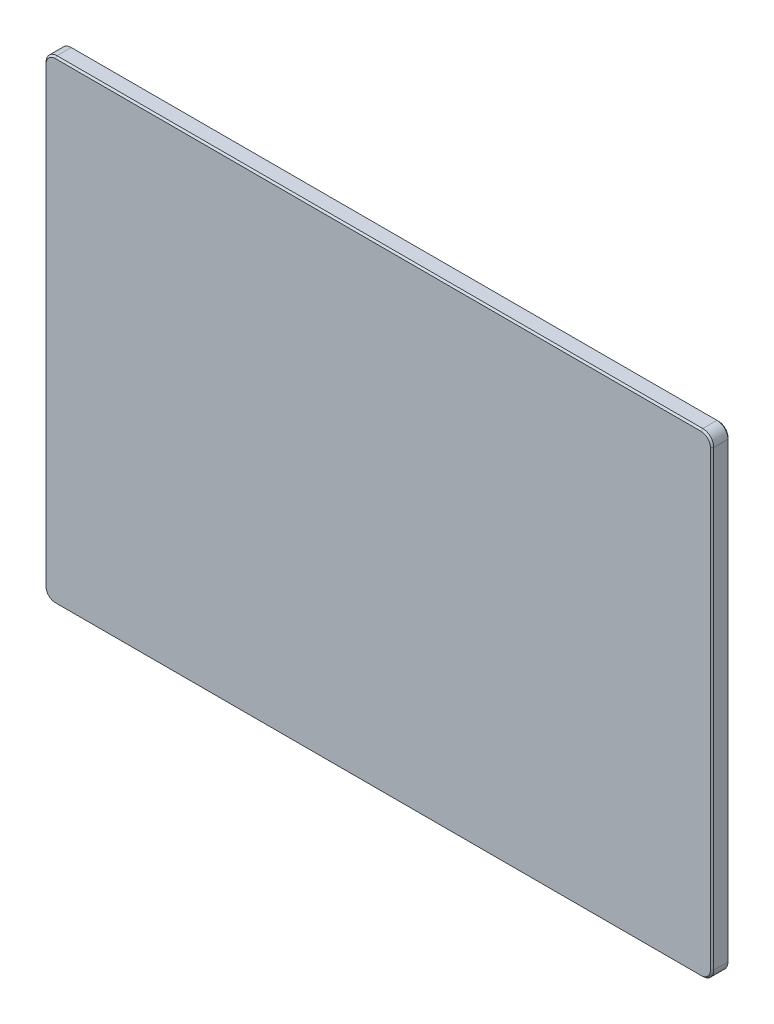
ISO-10303-21;
HEADER;
FILE_DESCRIPTION(('STEP AP214'),'2;1');
FILE_NAME('part.step','',(''),(''),'','','');
FILE_SCHEMA(('AUTOMOTIVE_DESIGN { 1 0 10303 214 1 1 1 1 }'));
ENDSEC;
DATA;
#1=APPLICATION_CONTEXT('core data for automotive mechanical design processes');
#2=APPLICATION_PROTOCOL_DEFINITION('international standard','automotive_design',2000,#1);
#3=PRODUCT_CONTEXT('',#1,'mechanical');
#4=PRODUCT('Part','Part','',(#3));
#5=PRODUCT_RELATED_PRODUCT_CATEGORY('part','',(#4));
#6=PRODUCT_DEFINITION_FORMATION('','',#4);
#7=PRODUCT_DEFINITION_CONTEXT('part definition',#1,'design');
#8=PRODUCT_DEFINITION('design','',#6,#7);
#9=PRODUCT_DEFINITION_SHAPE('','',#8);
#10=(LENGTH_UNIT() NAMED_UNIT(*) SI_UNIT(.MILLI.,.METRE.));
#11=(NAMED_UNIT(*) PLANE_ANGLE_UNIT() SI_UNIT($,.RADIAN.));
#12=(NAMED_UNIT(*) SI_UNIT($,.STERADIAN.) SOLID_ANGLE_UNIT());
#13=UNCERTAINTY_MEASURE_WITH_UNIT(LENGTH_MEASURE(1.E-05),#10,'distance_accuracy_value','');
#14=(GEOMETRIC_REPRESENTATION_CONTEXT(3) GLOBAL_UNCERTAINTY_ASSIGNED_CONTEXT((#13)) GLOBAL_UNIT_ASSIGNED_CONTEXT((#10,
#11,#12)) REPRESENTATION_CONTEXT('',''));
#15=CARTESIAN_POINT('',(0.,0.,0.));
#16=DIRECTION('',(0.,0.,1.));
#17=DIRECTION('',(1.,0.,0.));
#18=AXIS2_PLACEMENT_3D('',#15,#16,#17);
#19=CARTESIAN_POINT('',(-152.65,108.5,0.));
#20=DIRECTION('',(-1.,0.,0.));
#21=DIRECTION('',(0.,0.,1.));
#22=AXIS2_PLACEMENT_3D('',#19,#20,#21);
#23=PLANE('',#22);
#24=DIRECTION('',(0.,0.,1.));
#25=VECTOR('',#24,1.);
#26=CARTESIAN_POINT('',(-152.65,-103.5,0.));
#27=LINE('',#26,#25);
#28=CARTESIAN_POINT('',(-152.65,-103.5,0.749999999999918));
#29=VERTEX_POINT('',#28);
#30=CARTESIAN_POINT('',(-152.65,-103.5,7.24999999999992));
#31=VERTEX_POINT('',#30);
#32=EDGE_CURVE('E304',#29,#31,#27,.T.);
#33=ORIENTED_EDGE('',*,*,#32,.T.);
#34=DIRECTION('',(0.,1.,0.));
#35=VECTOR('',#34,1.);
#36=CARTESIAN_POINT('',(-152.65,108.5,7.24999999999992));
#37=LINE('',#36,#35);
#38=CARTESIAN_POINT('',(-152.65,103.5,7.24999999999992));
#39=VERTEX_POINT('',#38);
#40=EDGE_CURVE('E228',#31,#39,#37,.T.);
#41=ORIENTED_EDGE('',*,*,#40,.T.);
#42=DIRECTION('',(0.,0.,1.));
#43=VECTOR('',#42,1.);
#44=CARTESIAN_POINT('',(-152.65,103.5,0.));
#45=LINE('',#44,#43);
#46=CARTESIAN_POINT('',(-152.65,103.5,0.749999999999917));
#47=VERTEX_POINT('',#46);
#48=EDGE_CURVE('E170',#39,#47,#45,.F.);
#49=ORIENTED_EDGE('',*,*,#48,.T.);
#50=DIRECTION('',(0.,-1.,0.));
#51=VECTOR('',#50,1.);
#52=CARTESIAN_POINT('',(-152.65,-103.5,0.749999999999917));
#53=LINE('',#52,#51);
#54=EDGE_CURVE('E235',#47,#29,#53,.T.);
#55=ORIENTED_EDGE('',*,*,#54,.T.);
#56=EDGE_LOOP('',(#33,#41,#49,#55));
#57=FACE_BOUND('',#56,.T.);
#58=ADVANCED_FACE('F33',(#57),#23,.T.);
#59=CARTESIAN_POINT('',(152.65,108.5,0.));
#60=DIRECTION('',(0.,1.,0.));
#61=DIRECTION('',(0.,0.,1.));
#62=AXIS2_PLACEMENT_3D('',#59,#60,#61);
#63=PLANE('',#62);
#64=DIRECTION('',(0.,0.,1.));
#65=VECTOR('',#64,1.);
#66=CARTESIAN_POINT('',(-147.65,108.5,0.));
#67=LINE('',#66,#65);
#68=CARTESIAN_POINT('',(-147.65,108.5,0.749999999999918));
#69=VERTEX_POINT('',#68);
#70=CARTESIAN_POINT('',(-147.65,108.5,7.24999999999992));
#71=VERTEX_POINT('',#70);
#72=EDGE_CURVE('E314',#69,#71,#67,.T.);
#73=ORIENTED_EDGE('',*,*,#72,.T.);
#74=DIRECTION('',(1.,0.,0.));
#75=VECTOR('',#74,1.);
#76=CARTESIAN_POINT('',(152.65,108.5,7.24999999999992));
#77=LINE('',#76,#75);
#78=CARTESIAN_POINT('',(147.65,108.5,7.24999999999992));
#79=VERTEX_POINT('',#78);
#80=EDGE_CURVE('E287',#71,#79,#77,.T.);
#81=ORIENTED_EDGE('',*,*,#80,.T.);
#82=DIRECTION('',(0.,0.,1.));
#83=VECTOR('',#82,1.);
#84=CARTESIAN_POINT('',(147.65,108.5,0.));
#85=LINE('',#84,#83);
#86=CARTESIAN_POINT('',(147.65,108.5,0.749999999999918));
#87=VERTEX_POINT('',#86);
#88=EDGE_CURVE('E312',#79,#87,#85,.F.);
#89=ORIENTED_EDGE('',*,*,#88,.T.);
#90=DIRECTION('',(-1.,0.,0.));
#91=VECTOR('',#90,1.);
#92=CARTESIAN_POINT('',(-147.65,108.5,0.749999999999917));
#93=LINE('',#92,#91);
#94=EDGE_CURVE('E290',#87,#69,#93,.T.);
#95=ORIENTED_EDGE('',*,*,#94,.T.);
#96=EDGE_LOOP('',(#73,#81,#89,#95));
#97=FACE_BOUND('',#96,.T.);
#98=ADVANCED_FACE('F345',(#97),#63,.T.);
#99=CARTESIAN_POINT('',(152.65,-108.5,0.));
#100=DIRECTION('',(1.,0.,0.));
#101=DIRECTION('',(0.,0.,-1.));
#102=AXIS2_PLACEMENT_3D('',#99,#100,#101);
#103=PLANE('',#102);
#104=DIRECTION('',(0.,0.,1.));
#105=VECTOR('',#104,1.);
#106=CARTESIAN_POINT('',(152.65,103.5,0.));
#107=LINE('',#106,#105);
#108=CARTESIAN_POINT('',(152.65,103.5,0.749999999999917));
#109=VERTEX_POINT('',#108);
#110=CARTESIAN_POINT('',(152.65,103.5,7.24999999999992));
#111=VERTEX_POINT('',#110);
#112=EDGE_CURVE('E317',#109,#111,#107,.T.);
#113=ORIENTED_EDGE('',*,*,#112,.T.);
#114=DIRECTION('',(0.,-1.,0.));
#115=VECTOR('',#114,1.);
#116=CARTESIAN_POINT('',(152.65,-108.5,7.24999999999992));
#117=LINE('',#116,#115);
#118=CARTESIAN_POINT('',(152.65,-103.5,7.24999999999992));
#119=VERTEX_POINT('',#118);
#120=EDGE_CURVE('E237',#111,#119,#117,.T.);
#121=ORIENTED_EDGE('',*,*,#120,.T.);
#122=DIRECTION('',(0.,0.,1.));
#123=VECTOR('',#122,1.);
#124=CARTESIAN_POINT('',(152.65,-103.5,0.));
#125=LINE('',#124,#123);
#126=CARTESIAN_POINT('',(152.65,-103.5,0.749999999999918));
#127=VERTEX_POINT('',#126);
#128=EDGE_CURVE('E176',#119,#127,#125,.F.);
#129=ORIENTED_EDGE('',*,*,#128,.T.);
#130=DIRECTION('',(0.,1.,0.));
#131=VECTOR('',#130,1.);
#132=CARTESIAN_POINT('',(152.65,103.5,0.749999999999917));
#133=LINE('',#132,#131);
#134=EDGE_CURVE('E234',#127,#109,#133,.T.);
#135=ORIENTED_EDGE('',*,*,#134,.T.);
#136=EDGE_LOOP('',(#113,#121,#129,#135));
#137=FACE_BOUND('',#136,.T.);
#138=ADVANCED_FACE('F323',(#137),#103,.T.);
#139=CARTESIAN_POINT('',(-152.65,-108.5,0.));
#140=DIRECTION('',(0.,-1.,0.));
#141=DIRECTION('',(0.,0.,-1.));
#142=AXIS2_PLACEMENT_3D('',#139,#140,#141);
#143=PLANE('',#142);
#144=DIRECTION('',(0.,0.,1.));
#145=VECTOR('',#144,1.);
#146=CARTESIAN_POINT('',(147.65,-108.5,0.));
#147=LINE('',#146,#145);
#148=CARTESIAN_POINT('',(147.65,-108.5,0.749999999999917));
#149=VERTEX_POINT('',#148);
#150=CARTESIAN_POINT('',(147.65,-108.5,7.24999999999992));
#151=VERTEX_POINT('',#150);
#152=EDGE_CURVE('E306',#149,#151,#147,.T.);
#153=ORIENTED_EDGE('',*,*,#152,.T.);
#154=DIRECTION('',(-1.,0.,0.));
#155=VECTOR('',#154,1.);
#156=CARTESIAN_POINT('',(-152.65,-108.5,7.24999999999992));
#157=LINE('',#156,#155);
#158=CARTESIAN_POINT('',(-147.65,-108.5,7.24999999999992));
#159=VERTEX_POINT('',#158);
#160=EDGE_CURVE('E253',#151,#159,#157,.T.);
#161=ORIENTED_EDGE('',*,*,#160,.T.);
#162=DIRECTION('',(0.,0.,1.));
#163=VECTOR('',#162,1.);
#164=CARTESIAN_POINT('',(-147.65,-108.5,0.));
#165=LINE('',#164,#163);
#166=CARTESIAN_POINT('',(-147.65,-108.5,0.749999999999917));
#167=VERTEX_POINT('',#166);
#168=EDGE_CURVE('E309',#159,#167,#165,.F.);
#169=ORIENTED_EDGE('',*,*,#168,.T.);
#170=DIRECTION('',(1.,0.,0.));
#171=VECTOR('',#170,1.);
#172=CARTESIAN_POINT('',(147.65,-108.5,0.749999999999917));
#173=LINE('',#172,#171);
#174=EDGE_CURVE('E251',#167,#149,#173,.T.);
#175=ORIENTED_EDGE('',*,*,#174,.T.);
#176=EDGE_LOOP('',(#153,#161,#169,#175));
#177=FACE_BOUND('',#176,.T.);
#178=ADVANCED_FACE('F374',(#177),#143,.T.);
#179=CARTESIAN_POINT('',(0.,0.,0.));
#180=DIRECTION('',(0.,0.,1.));
#181=DIRECTION('',(1.,0.,0.));
#182=AXIS2_PLACEMENT_3D('',#179,#180,#181);
#183=PLANE('',#182);
#184=CARTESIAN_POINT('',(-147.65,103.5,0.));
#185=DIRECTION('',(0.,0.,1.));
#186=DIRECTION('',(1.,0.,0.));
#187=AXIS2_PLACEMENT_3D('',#184,#185,#186);
#188=CIRCLE('',#187,4.25000000000003);
#189=CARTESIAN_POINT('',(-151.9,103.5,0.));
#190=VERTEX_POINT('',#189);
#191=CARTESIAN_POINT('',(-147.65,107.75,0.));
#192=VERTEX_POINT('',#191);
#193=EDGE_CURVE('E42',#190,#192,#188,.F.);
#194=ORIENTED_EDGE('',*,*,#193,.T.);
#195=DIRECTION('',(1.,0.,0.));
#196=VECTOR('',#195,1.);
#197=CARTESIAN_POINT('',(147.65,107.75,0.));
#198=LINE('',#197,#196);
#199=CARTESIAN_POINT('',(147.65,107.75,0.));
#200=VERTEX_POINT('',#199);
#201=EDGE_CURVE('E11',#192,#200,#198,.T.);
#202=ORIENTED_EDGE('',*,*,#201,.T.);
#203=CARTESIAN_POINT('',(147.65,103.5,0.));
#204=DIRECTION('',(0.,0.,1.));
#205=DIRECTION('',(1.,0.,0.));
#206=AXIS2_PLACEMENT_3D('',#203,#204,#205);
#207=CIRCLE('',#206,4.25000000000003);
#208=CARTESIAN_POINT('',(151.9,103.5,0.));
#209=VERTEX_POINT('',#208);
#210=EDGE_CURVE('E265',#200,#209,#207,.F.);
#211=ORIENTED_EDGE('',*,*,#210,.T.);
#212=DIRECTION('',(0.,-1.,0.));
#213=VECTOR('',#212,1.);
#214=CARTESIAN_POINT('',(151.9,-103.5,0.));
#215=LINE('',#214,#213);
#216=CARTESIAN_POINT('',(151.9,-103.5,0.));
#217=VERTEX_POINT('',#216);
#218=EDGE_CURVE('E261',#209,#217,#215,.T.);
#219=ORIENTED_EDGE('',*,*,#218,.T.);
#220=CARTESIAN_POINT('',(147.65,-103.5,0.));
#221=DIRECTION('',(0.,0.,1.));
#222=DIRECTION('',(1.,0.,0.));
#223=AXIS2_PLACEMENT_3D('',#220,#221,#222);
#224=CIRCLE('',#223,4.25000000000003);
#225=CARTESIAN_POINT('',(147.65,-107.75,0.));
#226=VERTEX_POINT('',#225);
#227=EDGE_CURVE('E257',#217,#226,#224,.F.);
#228=ORIENTED_EDGE('',*,*,#227,.T.);
#229=DIRECTION('',(-1.,0.,0.));
#230=VECTOR('',#229,1.);
#231=CARTESIAN_POINT('',(-147.65,-107.75,0.));
#232=LINE('',#231,#230);
#233=CARTESIAN_POINT('',(-147.65,-107.75,0.));
#234=VERTEX_POINT('',#233);
#235=EDGE_CURVE('E255',#226,#234,#232,.T.);
#236=ORIENTED_EDGE('',*,*,#235,.T.);
#237=CARTESIAN_POINT('',(-147.65,-103.5,0.));
#238=DIRECTION('',(0.,0.,1.));
#239=DIRECTION('',(1.,0.,0.));
#240=AXIS2_PLACEMENT_3D('',#237,#238,#239);
#241=CIRCLE('',#240,4.25000000000003);
#242=CARTESIAN_POINT('',(-151.9,-103.5,0.));
#243=VERTEX_POINT('',#242);
#244=EDGE_CURVE('E259',#234,#243,#241,.F.);
#245=ORIENTED_EDGE('',*,*,#244,.T.);
#246=DIRECTION('',(0.,1.,0.));
#247=VECTOR('',#246,1.);
#248=CARTESIAN_POINT('',(-151.9,103.5,0.));
#249=LINE('',#248,#247);
#250=EDGE_CURVE('E263',#243,#190,#249,.T.);
#251=ORIENTED_EDGE('',*,*,#250,.T.);
#252=EDGE_LOOP('',(#194,#202,#211,#219,#228,#236,#245,#251));
#253=FACE_BOUND('',#252,.T.);
#254=ADVANCED_FACE('F267',(#253),#183,.F.);
#255=CARTESIAN_POINT('',(0.,0.,8.));
#256=DIRECTION('',(0.,0.,1.));
#257=DIRECTION('',(1.,0.,0.));
#258=AXIS2_PLACEMENT_3D('',#255,#256,#257);
#259=PLANE('',#258);
#260=CARTESIAN_POINT('',(147.65,103.5,8.));
#261=DIRECTION('',(0.,0.,1.));
#262=DIRECTION('',(1.,0.,0.));
#263=AXIS2_PLACEMENT_3D('',#260,#261,#262);
#264=CIRCLE('',#263,4.24999999999998);
#265=CARTESIAN_POINT('',(151.9,103.5,8.));
#266=VERTEX_POINT('',#265);
#267=CARTESIAN_POINT('',(147.65,107.75,8.));
#268=VERTEX_POINT('',#267);
#269=EDGE_CURVE('E298',#266,#268,#264,.T.);
#270=ORIENTED_EDGE('',*,*,#269,.T.);
#271=DIRECTION('',(-1.,0.,0.));
#272=VECTOR('',#271,1.);
#273=CARTESIAN_POINT('',(0.,107.75,8.));
#274=LINE('',#273,#272);
#275=CARTESIAN_POINT('',(-147.65,107.75,8.));
#276=VERTEX_POINT('',#275);
#277=EDGE_CURVE('E293',#268,#276,#274,.T.);
#278=ORIENTED_EDGE('',*,*,#277,.T.);
#279=CARTESIAN_POINT('',(-147.65,103.5,8.));
#280=DIRECTION('',(0.,0.,1.));
#281=DIRECTION('',(1.,0.,0.));
#282=AXIS2_PLACEMENT_3D('',#279,#280,#281);
#283=CIRCLE('',#282,4.24999999999998);
#284=CARTESIAN_POINT('',(-151.9,103.5,8.));
#285=VERTEX_POINT('',#284);
#286=EDGE_CURVE('E296',#276,#285,#283,.T.);
#287=ORIENTED_EDGE('',*,*,#286,.T.);
#288=DIRECTION('',(0.,-1.,0.));
#289=VECTOR('',#288,1.);
#290=CARTESIAN_POINT('',(-151.9,0.,8.));
#291=LINE('',#290,#289);
#292=CARTESIAN_POINT('',(-151.9,-103.5,8.));
#293=VERTEX_POINT('',#292);
#294=EDGE_CURVE('E153',#285,#293,#291,.T.);
#295=ORIENTED_EDGE('',*,*,#294,.T.);
#296=CARTESIAN_POINT('',(-147.65,-103.5,8.));
#297=DIRECTION('',(0.,0.,1.));
#298=DIRECTION('',(1.,0.,0.));
#299=AXIS2_PLACEMENT_3D('',#296,#297,#298);
#300=CIRCLE('',#299,4.24999999999998);
#301=CARTESIAN_POINT('',(-147.65,-107.75,8.));
#302=VERTEX_POINT('',#301);
#303=EDGE_CURVE('E147',#293,#302,#300,.T.);
#304=ORIENTED_EDGE('',*,*,#303,.T.);
#305=DIRECTION('',(1.,0.,0.));
#306=VECTOR('',#305,1.);
#307=CARTESIAN_POINT('',(0.,-107.75,8.));
#308=LINE('',#307,#306);
#309=CARTESIAN_POINT('',(147.65,-107.75,8.));
#310=VERTEX_POINT('',#309);
#311=EDGE_CURVE('E150',#302,#310,#308,.T.);
#312=ORIENTED_EDGE('',*,*,#311,.T.);
#313=CARTESIAN_POINT('',(147.65,-103.5,8.));
#314=DIRECTION('',(0.,0.,1.));
#315=DIRECTION('',(1.,0.,0.));
#316=AXIS2_PLACEMENT_3D('',#313,#314,#315);
#317=CIRCLE('',#316,4.24999999999998);
#318=CARTESIAN_POINT('',(151.9,-103.5,8.));
#319=VERTEX_POINT('',#318);
#320=EDGE_CURVE('E159',#310,#319,#317,.T.);
#321=ORIENTED_EDGE('',*,*,#320,.T.);
#322=DIRECTION('',(0.,1.,0.));
#323=VECTOR('',#322,1.);
#324=CARTESIAN_POINT('',(151.9,0.,8.));
#325=LINE('',#324,#323);
#326=EDGE_CURVE('E158',#319,#266,#325,.T.);
#327=ORIENTED_EDGE('',*,*,#326,.T.);
#328=EDGE_LOOP('',(#270,#278,#287,#295,#304,#312,#321,#327));
#329=FACE_BOUND('',#328,.T.);
#330=ADVANCED_FACE('F149',(#329),#259,.T.);
#331=CARTESIAN_POINT('',(147.65,103.5,0.));
#332=DIRECTION('',(0.,0.,1.));
#333=DIRECTION('',(1.,0.,0.));
#334=AXIS2_PLACEMENT_3D('',#331,#332,#333);
#335=CYLINDRICAL_SURFACE('',#334,5.);
#336=ORIENTED_EDGE('',*,*,#88,.F.);
#337=CARTESIAN_POINT('',(147.65,103.5,7.24999999999992));
#338=DIRECTION('',(0.,0.,1.));
#339=DIRECTION('',(1.,0.,0.));
#340=AXIS2_PLACEMENT_3D('',#337,#338,#339);
#341=CIRCLE('',#340,5.);
#342=EDGE_CURVE('E239',#79,#111,#341,.F.);
#343=ORIENTED_EDGE('',*,*,#342,.T.);
#344=ORIENTED_EDGE('',*,*,#112,.F.);
#345=CARTESIAN_POINT('',(147.65,103.5,0.749999999999918));
#346=DIRECTION('',(0.,0.,1.));
#347=DIRECTION('',(1.,0.,0.));
#348=AXIS2_PLACEMENT_3D('',#345,#346,#347);
#349=CIRCLE('',#348,5.);
#350=EDGE_CURVE('E276',#109,#87,#349,.T.);
#351=ORIENTED_EDGE('',*,*,#350,.T.);
#352=EDGE_LOOP('',(#336,#343,#344,#351));
#353=FACE_BOUND('',#352,.T.);
#354=ADVANCED_FACE('F357',(#353),#335,.T.);
#355=CARTESIAN_POINT('',(147.65,-103.5,0.));
#356=DIRECTION('',(0.,0.,1.));
#357=DIRECTION('',(1.,0.,0.));
#358=AXIS2_PLACEMENT_3D('',#355,#356,#357);
#359=CYLINDRICAL_SURFACE('',#358,5.);
#360=ORIENTED_EDGE('',*,*,#128,.F.);
#361=CARTESIAN_POINT('',(147.65,-103.5,7.24999999999992));
#362=DIRECTION('',(0.,0.,1.));
#363=DIRECTION('',(1.,0.,0.));
#364=AXIS2_PLACEMENT_3D('',#361,#362,#363);
#365=CIRCLE('',#364,5.);
#366=EDGE_CURVE('E249',#119,#151,#365,.F.);
#367=ORIENTED_EDGE('',*,*,#366,.T.);
#368=ORIENTED_EDGE('',*,*,#152,.F.);
#369=CARTESIAN_POINT('',(147.65,-103.5,0.749999999999918));
#370=DIRECTION('',(0.,0.,1.));
#371=DIRECTION('',(1.,0.,0.));
#372=AXIS2_PLACEMENT_3D('',#369,#370,#371);
#373=CIRCLE('',#372,5.);
#374=EDGE_CURVE('E247',#149,#127,#373,.T.);
#375=ORIENTED_EDGE('',*,*,#374,.T.);
#376=EDGE_LOOP('',(#360,#367,#368,#375));
#377=FACE_BOUND('',#376,.T.);
#378=ADVANCED_FACE('F359',(#377),#359,.T.);
#379=CARTESIAN_POINT('',(-147.65,103.5,0.));
#380=DIRECTION('',(0.,0.,1.));
#381=DIRECTION('',(1.,0.,0.));
#382=AXIS2_PLACEMENT_3D('',#379,#380,#381);
#383=CYLINDRICAL_SURFACE('',#382,5.);
#384=ORIENTED_EDGE('',*,*,#48,.F.);
#385=CARTESIAN_POINT('',(-147.65,103.5,7.24999999999992));
#386=DIRECTION('',(0.,0.,1.));
#387=DIRECTION('',(1.,0.,0.));
#388=AXIS2_PLACEMENT_3D('',#385,#386,#387);
#389=CIRCLE('',#388,5.);
#390=EDGE_CURVE('E281',#39,#71,#389,.F.);
#391=ORIENTED_EDGE('',*,*,#390,.T.);
#392=ORIENTED_EDGE('',*,*,#72,.F.);
#393=CARTESIAN_POINT('',(-147.65,103.5,0.749999999999918));
#394=DIRECTION('',(0.,0.,1.));
#395=DIRECTION('',(1.,0.,0.));
#396=AXIS2_PLACEMENT_3D('',#393,#394,#395);
#397=CIRCLE('',#396,5.);
#398=EDGE_CURVE('E283',#69,#47,#397,.T.);
#399=ORIENTED_EDGE('',*,*,#398,.T.);
#400=EDGE_LOOP('',(#384,#391,#392,#399));
#401=FACE_BOUND('',#400,.T.);
#402=ADVANCED_FACE('F347',(#401),#383,.T.);
#403=CARTESIAN_POINT('',(-147.65,-103.5,0.));
#404=DIRECTION('',(0.,0.,1.));
#405=DIRECTION('',(1.,0.,0.));
#406=AXIS2_PLACEMENT_3D('',#403,#404,#405);
#407=CYLINDRICAL_SURFACE('',#406,5.);
#408=ORIENTED_EDGE('',*,*,#168,.F.);
#409=CARTESIAN_POINT('',(-147.65,-103.5,7.24999999999992));
#410=DIRECTION('',(0.,0.,1.));
#411=DIRECTION('',(1.,0.,0.));
#412=AXIS2_PLACEMENT_3D('',#409,#410,#411);
#413=CIRCLE('',#412,5.);
#414=EDGE_CURVE('E173',#159,#31,#413,.F.);
#415=ORIENTED_EDGE('',*,*,#414,.T.);
#416=ORIENTED_EDGE('',*,*,#32,.F.);
#417=CARTESIAN_POINT('',(-147.65,-103.5,0.749999999999918));
#418=DIRECTION('',(0.,0.,1.));
#419=DIRECTION('',(1.,0.,0.));
#420=AXIS2_PLACEMENT_3D('',#417,#418,#419);
#421=CIRCLE('',#420,5.);
#422=EDGE_CURVE('E244',#29,#167,#421,.T.);
#423=ORIENTED_EDGE('',*,*,#422,.T.);
#424=EDGE_LOOP('',(#408,#415,#416,#423));
#425=FACE_BOUND('',#424,.T.);
#426=ADVANCED_FACE('F408',(#425),#407,.T.);
#427=CARTESIAN_POINT('',(0.,-107.75,8.));
#428=DIRECTION('',(0.,0.707106781186574,-0.707106781186521));
#429=DIRECTION('',(1.,0.,0.));
#430=AXIS2_PLACEMENT_3D('',#427,#428,#429);
#431=PLANE('',#430);
#432=DIRECTION('',(0.,0.707106781186521,0.707106781186574));
#433=VECTOR('',#432,1.);
#434=CARTESIAN_POINT('',(-147.65,-108.5,7.24999999999992));
#435=LINE('',#434,#433);
#436=EDGE_CURVE('E165',#159,#302,#435,.T.);
#437=ORIENTED_EDGE('',*,*,#436,.F.);
#438=ORIENTED_EDGE('',*,*,#160,.F.);
#439=DIRECTION('',(0.,-0.707106781186521,-0.707106781186574));
#440=VECTOR('',#439,1.);
#441=CARTESIAN_POINT('',(147.65,-107.75,8.));
#442=LINE('',#441,#440);
#443=EDGE_CURVE('E168',#310,#151,#442,.T.);
#444=ORIENTED_EDGE('',*,*,#443,.F.);
#445=ORIENTED_EDGE('',*,*,#311,.F.);
#446=EDGE_LOOP('',(#437,#438,#444,#445));
#447=FACE_BOUND('',#446,.T.);
#448=ADVANCED_FACE('F163',(#447),#431,.F.);
#449=CARTESIAN_POINT('',(147.65,-103.5,8.));
#450=DIRECTION('',(0.,0.,-1.));
#451=DIRECTION('',(-1.,0.,0.));
#452=AXIS2_PLACEMENT_3D('',#449,#450,#451);
#453=CONICAL_SURFACE('',#452,4.24999999999998,0.785398163397408);
#454=ORIENTED_EDGE('',*,*,#443,.T.);
#455=ORIENTED_EDGE('',*,*,#366,.F.);
#456=DIRECTION('',(0.707106781186521,0.,-0.707106781186574));
#457=VECTOR('',#456,1.);
#458=CARTESIAN_POINT('',(151.9,-103.5,8.));
#459=LINE('',#458,#457);
#460=EDGE_CURVE('E174',#319,#119,#459,.T.);
#461=ORIENTED_EDGE('',*,*,#460,.F.);
#462=ORIENTED_EDGE('',*,*,#320,.F.);
#463=EDGE_LOOP('',(#454,#455,#461,#462));
#464=FACE_BOUND('',#463,.T.);
#465=ADVANCED_FACE('F426',(#464),#453,.T.);
#466=CARTESIAN_POINT('',(-147.65,-103.5,8.));
#467=DIRECTION('',(0.,0.,-1.));
#468=DIRECTION('',(-1.,0.,0.));
#469=AXIS2_PLACEMENT_3D('',#466,#467,#468);
#470=CONICAL_SURFACE('',#469,4.24999999999998,0.785398163397408);
#471=ORIENTED_EDGE('',*,*,#436,.T.);
#472=ORIENTED_EDGE('',*,*,#303,.F.);
#473=DIRECTION('',(0.707106781186521,0.,0.707106781186574));
#474=VECTOR('',#473,1.);
#475=CARTESIAN_POINT('',(-152.65,-103.5,7.24999999999992));
#476=LINE('',#475,#474);
#477=EDGE_CURVE('E179',#31,#293,#476,.T.);
#478=ORIENTED_EDGE('',*,*,#477,.F.);
#479=ORIENTED_EDGE('',*,*,#414,.F.);
#480=EDGE_LOOP('',(#471,#472,#478,#479));
#481=FACE_BOUND('',#480,.T.);
#482=ADVANCED_FACE('F172',(#481),#470,.T.);
#483=CARTESIAN_POINT('',(151.9,0.,8.));
#484=DIRECTION('',(-0.707106781186574,0.,-0.707106781186521));
#485=DIRECTION('',(0.,1.,0.));
#486=AXIS2_PLACEMENT_3D('',#483,#484,#485);
#487=PLANE('',#486);
#488=ORIENTED_EDGE('',*,*,#460,.T.);
#489=ORIENTED_EDGE('',*,*,#120,.F.);
#490=DIRECTION('',(0.707106781186521,0.,-0.707106781186574));
#491=VECTOR('',#490,1.);
#492=CARTESIAN_POINT('',(151.9,103.5,8.));
#493=LINE('',#492,#491);
#494=EDGE_CURVE('E222',#266,#111,#493,.T.);
#495=ORIENTED_EDGE('',*,*,#494,.F.);
#496=ORIENTED_EDGE('',*,*,#326,.F.);
#497=EDGE_LOOP('',(#488,#489,#495,#496));
#498=FACE_BOUND('',#497,.T.);
#499=ADVANCED_FACE('F444',(#498),#487,.F.);
#500=CARTESIAN_POINT('',(-151.9,0.,8.));
#501=DIRECTION('',(0.707106781186574,0.,-0.707106781186521));
#502=DIRECTION('',(0.,-1.,0.));
#503=AXIS2_PLACEMENT_3D('',#500,#501,#502);
#504=PLANE('',#503);
#505=ORIENTED_EDGE('',*,*,#477,.T.);
#506=ORIENTED_EDGE('',*,*,#294,.F.);
#507=DIRECTION('',(0.707106781186521,0.,0.707106781186574));
#508=VECTOR('',#507,1.);
#509=CARTESIAN_POINT('',(-152.65,103.5,7.24999999999992));
#510=LINE('',#509,#508);
#511=EDGE_CURVE('E216',#39,#285,#510,.T.);
#512=ORIENTED_EDGE('',*,*,#511,.F.);
#513=ORIENTED_EDGE('',*,*,#40,.F.);
#514=EDGE_LOOP('',(#505,#506,#512,#513));
#515=FACE_BOUND('',#514,.T.);
#516=ADVANCED_FACE('F226',(#515),#504,.F.);
#517=CARTESIAN_POINT('',(147.65,103.5,8.));
#518=DIRECTION('',(0.,0.,-1.));
#519=DIRECTION('',(-1.,0.,0.));
#520=AXIS2_PLACEMENT_3D('',#517,#518,#519);
#521=CONICAL_SURFACE('',#520,4.24999999999998,0.785398163397408);
#522=ORIENTED_EDGE('',*,*,#494,.T.);
#523=ORIENTED_EDGE('',*,*,#342,.F.);
#524=DIRECTION('',(0.,0.707106781186521,-0.707106781186574));
#525=VECTOR('',#524,1.);
#526=CARTESIAN_POINT('',(147.65,107.75,8.));
#527=LINE('',#526,#525);
#528=EDGE_CURVE('E209',#268,#79,#527,.T.);
#529=ORIENTED_EDGE('',*,*,#528,.F.);
#530=ORIENTED_EDGE('',*,*,#269,.F.);
#531=EDGE_LOOP('',(#522,#523,#529,#530));
#532=FACE_BOUND('',#531,.T.);
#533=ADVANCED_FACE('F355',(#532),#521,.T.);
#534=CARTESIAN_POINT('',(-147.65,103.5,8.));
#535=DIRECTION('',(0.,0.,-1.));
#536=DIRECTION('',(-1.,0.,0.));
#537=AXIS2_PLACEMENT_3D('',#534,#535,#536);
#538=CONICAL_SURFACE('',#537,4.24999999999998,0.785398163397408);
#539=ORIENTED_EDGE('',*,*,#511,.T.);
#540=ORIENTED_EDGE('',*,*,#286,.F.);
#541=DIRECTION('',(0.,-0.707106781186521,0.707106781186574));
#542=VECTOR('',#541,1.);
#543=CARTESIAN_POINT('',(-147.65,108.5,7.24999999999992));
#544=LINE('',#543,#542);
#545=EDGE_CURVE('E204',#71,#276,#544,.T.);
#546=ORIENTED_EDGE('',*,*,#545,.F.);
#547=ORIENTED_EDGE('',*,*,#390,.F.);
#548=EDGE_LOOP('',(#539,#540,#546,#547));
#549=FACE_BOUND('',#548,.T.);
#550=ADVANCED_FACE('F349',(#549),#538,.T.);
#551=CARTESIAN_POINT('',(0.,107.75,8.));
#552=DIRECTION('',(0.,-0.707106781186574,-0.707106781186521));
#553=DIRECTION('',(-1.,0.,0.));
#554=AXIS2_PLACEMENT_3D('',#551,#552,#553);
#555=PLANE('',#554);
#556=ORIENTED_EDGE('',*,*,#528,.T.);
#557=ORIENTED_EDGE('',*,*,#80,.F.);
#558=ORIENTED_EDGE('',*,*,#545,.T.);
#559=ORIENTED_EDGE('',*,*,#277,.F.);
#560=EDGE_LOOP('',(#556,#557,#558,#559));
#561=FACE_BOUND('',#560,.T.);
#562=ADVANCED_FACE('F352',(#561),#555,.F.);
#563=CARTESIAN_POINT('',(-152.65,-108.5,0.749999999999917));
#564=DIRECTION('',(0.,-0.707106781186521,-0.707106781186574));
#565=DIRECTION('',(-1.,0.,0.));
#566=AXIS2_PLACEMENT_3D('',#563,#564,#565);
#567=PLANE('',#566);
#568=DIRECTION('',(0.,-0.707106781186574,0.707106781186521));
#569=VECTOR('',#568,1.);
#570=CARTESIAN_POINT('',(-147.65,-107.75,0.));
#571=LINE('',#570,#569);
#572=EDGE_CURVE('E197',#234,#167,#571,.T.);
#573=ORIENTED_EDGE('',*,*,#572,.F.);
#574=ORIENTED_EDGE('',*,*,#235,.F.);
#575=DIRECTION('',(0.,0.707106781186574,-0.707106781186521));
#576=VECTOR('',#575,1.);
#577=CARTESIAN_POINT('',(147.65,-108.5,0.749999999999917));
#578=LINE('',#577,#576);
#579=EDGE_CURVE('E37',#149,#226,#578,.T.);
#580=ORIENTED_EDGE('',*,*,#579,.F.);
#581=ORIENTED_EDGE('',*,*,#174,.F.);
#582=EDGE_LOOP('',(#573,#574,#580,#581));
#583=FACE_BOUND('',#582,.T.);
#584=ADVANCED_FACE('F35',(#583),#567,.T.);
#585=CARTESIAN_POINT('',(147.65,-103.5,0.));
#586=DIRECTION('',(0.,0.,1.));
#587=DIRECTION('',(1.,0.,0.));
#588=AXIS2_PLACEMENT_3D('',#585,#586,#587);
#589=CONICAL_SURFACE('',#588,4.25000000000003,0.785398163397482);
#590=ORIENTED_EDGE('',*,*,#579,.T.);
#591=ORIENTED_EDGE('',*,*,#227,.F.);
#592=DIRECTION('',(-0.707106781186574,0.,-0.707106781186521));
#593=VECTOR('',#592,1.);
#594=CARTESIAN_POINT('',(152.65,-103.5,0.749999999999918));
#595=LINE('',#594,#593);
#596=EDGE_CURVE('E195',#127,#217,#595,.T.);
#597=ORIENTED_EDGE('',*,*,#596,.F.);
#598=ORIENTED_EDGE('',*,*,#374,.F.);
#599=EDGE_LOOP('',(#590,#591,#597,#598));
#600=FACE_BOUND('',#599,.T.);
#601=ADVANCED_FACE('F327',(#600),#589,.T.);
#602=CARTESIAN_POINT('',(-147.65,-103.5,0.));
#603=DIRECTION('',(0.,0.,1.));
#604=DIRECTION('',(1.,0.,0.));
#605=AXIS2_PLACEMENT_3D('',#602,#603,#604);
#606=CONICAL_SURFACE('',#605,4.25000000000003,0.785398163397482);
#607=ORIENTED_EDGE('',*,*,#572,.T.);
#608=ORIENTED_EDGE('',*,*,#422,.F.);
#609=DIRECTION('',(-0.707106781186574,0.,0.707106781186521));
#610=VECTOR('',#609,1.);
#611=CARTESIAN_POINT('',(-151.9,-103.5,0.));
#612=LINE('',#611,#610);
#613=EDGE_CURVE('E192',#243,#29,#612,.T.);
#614=ORIENTED_EDGE('',*,*,#613,.F.);
#615=ORIENTED_EDGE('',*,*,#244,.F.);
#616=EDGE_LOOP('',(#607,#608,#614,#615));
#617=FACE_BOUND('',#616,.T.);
#618=ADVANCED_FACE('F332',(#617),#606,.T.);
#619=CARTESIAN_POINT('',(152.65,-108.5,0.749999999999917));
#620=DIRECTION('',(0.707106781186521,0.,-0.707106781186574));
#621=DIRECTION('',(0.,-1.,0.));
#622=AXIS2_PLACEMENT_3D('',#619,#620,#621);
#623=PLANE('',#622);
#624=ORIENTED_EDGE('',*,*,#596,.T.);
#625=ORIENTED_EDGE('',*,*,#218,.F.);
#626=DIRECTION('',(-0.707106781186574,0.,-0.707106781186521));
#627=VECTOR('',#626,1.);
#628=CARTESIAN_POINT('',(152.65,103.5,0.749999999999917));
#629=LINE('',#628,#627);
#630=EDGE_CURVE('E189',#109,#209,#629,.T.);
#631=ORIENTED_EDGE('',*,*,#630,.F.);
#632=ORIENTED_EDGE('',*,*,#134,.F.);
#633=EDGE_LOOP('',(#624,#625,#631,#632));
#634=FACE_BOUND('',#633,.T.);
#635=ADVANCED_FACE('F271',(#634),#623,.T.);
#636=CARTESIAN_POINT('',(-152.65,108.5,0.749999999999917));
#637=DIRECTION('',(-0.707106781186521,0.,-0.707106781186574));
#638=DIRECTION('',(0.,1.,0.));
#639=AXIS2_PLACEMENT_3D('',#636,#637,#638);
#640=PLANE('',#639);
#641=ORIENTED_EDGE('',*,*,#613,.T.);
#642=ORIENTED_EDGE('',*,*,#54,.F.);
#643=DIRECTION('',(-0.707106781186574,0.,0.707106781186521));
#644=VECTOR('',#643,1.);
#645=CARTESIAN_POINT('',(-151.9,103.5,0.));
#646=LINE('',#645,#644);
#647=EDGE_CURVE('E186',#190,#47,#646,.T.);
#648=ORIENTED_EDGE('',*,*,#647,.F.);
#649=ORIENTED_EDGE('',*,*,#250,.F.);
#650=EDGE_LOOP('',(#641,#642,#648,#649));
#651=FACE_BOUND('',#650,.T.);
#652=ADVANCED_FACE('F337',(#651),#640,.T.);
#653=CARTESIAN_POINT('',(147.65,103.5,0.));
#654=DIRECTION('',(0.,0.,1.));
#655=DIRECTION('',(1.,0.,0.));
#656=AXIS2_PLACEMENT_3D('',#653,#654,#655);
#657=CONICAL_SURFACE('',#656,4.25000000000003,0.785398163397482);
#658=ORIENTED_EDGE('',*,*,#630,.T.);
#659=ORIENTED_EDGE('',*,*,#210,.F.);
#660=DIRECTION('',(0.,-0.707106781186574,-0.707106781186521));
#661=VECTOR('',#660,1.);
#662=CARTESIAN_POINT('',(147.65,108.5,0.749999999999918));
#663=LINE('',#662,#661);
#664=EDGE_CURVE('E55',#87,#200,#663,.T.);
#665=ORIENTED_EDGE('',*,*,#664,.F.);
#666=ORIENTED_EDGE('',*,*,#350,.F.);
#667=EDGE_LOOP('',(#658,#659,#665,#666));
#668=FACE_BOUND('',#667,.T.);
#669=ADVANCED_FACE('F275',(#668),#657,.T.);
#670=CARTESIAN_POINT('',(-147.65,103.5,0.));
#671=DIRECTION('',(0.,0.,1.));
#672=DIRECTION('',(1.,0.,0.));
#673=AXIS2_PLACEMENT_3D('',#670,#671,#672);
#674=CONICAL_SURFACE('',#673,4.25000000000003,0.785398163397482);
#675=ORIENTED_EDGE('',*,*,#647,.T.);
#676=ORIENTED_EDGE('',*,*,#398,.F.);
#677=DIRECTION('',(0.,0.707106781186574,0.707106781186521));
#678=VECTOR('',#677,1.);
#679=CARTESIAN_POINT('',(-147.65,107.75,0.));
#680=LINE('',#679,#678);
#681=EDGE_CURVE('E183',#192,#69,#680,.T.);
#682=ORIENTED_EDGE('',*,*,#681,.F.);
#683=ORIENTED_EDGE('',*,*,#193,.F.);
#684=EDGE_LOOP('',(#675,#676,#682,#683));
#685=FACE_BOUND('',#684,.T.);
#686=ADVANCED_FACE('F341',(#685),#674,.T.);
#687=CARTESIAN_POINT('',(152.65,108.5,0.749999999999917));
#688=DIRECTION('',(0.,0.707106781186521,-0.707106781186574));
#689=DIRECTION('',(1.,0.,0.));
#690=AXIS2_PLACEMENT_3D('',#687,#688,#689);
#691=PLANE('',#690);
#692=ORIENTED_EDGE('',*,*,#664,.T.);
#693=ORIENTED_EDGE('',*,*,#201,.F.);
#694=ORIENTED_EDGE('',*,*,#681,.T.);
#695=ORIENTED_EDGE('',*,*,#94,.F.);
#696=EDGE_LOOP('',(#692,#693,#694,#695));
#697=FACE_BOUND('',#696,.T.);
#698=ADVANCED_FACE('F342',(#697),#691,.T.);
#699=CLOSED_SHELL('',(#58,#98,#138,#178,#254,#330,#354,#378,#402,#426,#448,#465,#482,#499,#516,
#533,#550,#562,#584,#601,#618,#635,#652,#669,#686,#698));
#700=MANIFOLD_SOLID_BREP('B2',#699);
#701=ADVANCED_BREP_SHAPE_REPRESENTATION('',(#18,#700),#14);
#702=SHAPE_DEFINITION_REPRESENTATION(#9,#701);
ENDSEC;
END-ISO-10303-21;
